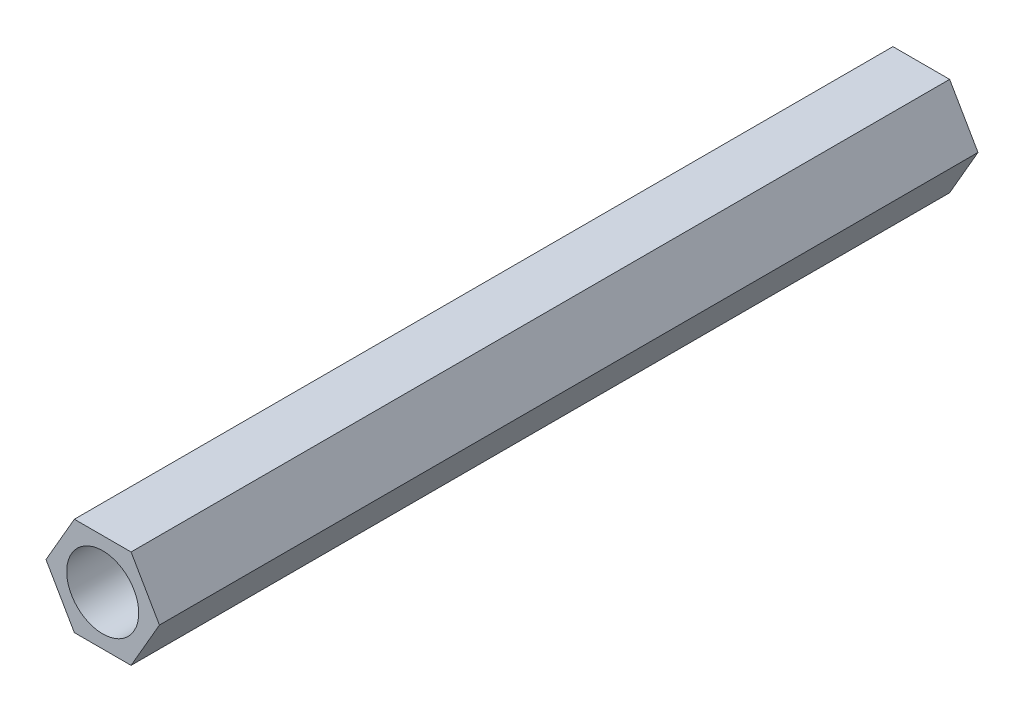
ISO-10303-21;
HEADER;
FILE_DESCRIPTION(('STEP AP214'),'2;1');
FILE_NAME('part.step','',(''),(''),'','','');
FILE_SCHEMA(('AUTOMOTIVE_DESIGN { 1 0 10303 214 1 1 1 1 }'));
ENDSEC;
DATA;
#1=APPLICATION_CONTEXT('core data for automotive mechanical design processes');
#2=APPLICATION_PROTOCOL_DEFINITION('international standard','automotive_design',2000,#1);
#3=PRODUCT_CONTEXT('',#1,'mechanical');
#4=PRODUCT('Part','Part','',(#3));
#5=PRODUCT_RELATED_PRODUCT_CATEGORY('part','',(#4));
#6=PRODUCT_DEFINITION_FORMATION('','',#4);
#7=PRODUCT_DEFINITION_CONTEXT('part definition',#1,'design');
#8=PRODUCT_DEFINITION('design','',#6,#7);
#9=PRODUCT_DEFINITION_SHAPE('','',#8);
#10=(LENGTH_UNIT() NAMED_UNIT(*) SI_UNIT(.MILLI.,.METRE.));
#11=(NAMED_UNIT(*) PLANE_ANGLE_UNIT() SI_UNIT($,.RADIAN.));
#12=(NAMED_UNIT(*) SI_UNIT($,.STERADIAN.) SOLID_ANGLE_UNIT());
#13=UNCERTAINTY_MEASURE_WITH_UNIT(LENGTH_MEASURE(1.E-05),#10,'distance_accuracy_value','');
#14=(GEOMETRIC_REPRESENTATION_CONTEXT(3) GLOBAL_UNCERTAINTY_ASSIGNED_CONTEXT((#13)) GLOBAL_UNIT_ASSIGNED_CONTEXT((#10,
#11,#12)) REPRESENTATION_CONTEXT('',''));
#15=CARTESIAN_POINT('',(0.,0.,0.));
#16=DIRECTION('',(0.,0.,1.));
#17=DIRECTION('',(1.,0.,0.));
#18=AXIS2_PLACEMENT_3D('',#15,#16,#17);
#19=CARTESIAN_POINT('',(0.866025403784453,-1.49999999999998,25.));
#20=DIRECTION('',(-0.866025403784442,0.499999999999995,0.));
#21=DIRECTION('',(-0.499999999999995,-0.866025403784442,0.));
#22=AXIS2_PLACEMENT_3D('',#19,#20,#21);
#23=PLANE('',#22);
#24=DIRECTION('',(0.499999999999995,0.866025403784441,0.));
#25=VECTOR('',#24,1.);
#26=CARTESIAN_POINT('',(0.866025403784453,-1.49999999999998,0.));
#27=LINE('',#26,#25);
#28=CARTESIAN_POINT('',(0.866025403784453,-1.49999999999998,0.));
#29=VERTEX_POINT('',#28);
#30=CARTESIAN_POINT('',(1.73205080756887,0.,0.));
#31=VERTEX_POINT('',#30);
#32=EDGE_CURVE('E119',#29,#31,#27,.T.);
#33=ORIENTED_EDGE('',*,*,#32,.T.);
#34=DIRECTION('',(0.,0.,-1.));
#35=VECTOR('',#34,1.);
#36=CARTESIAN_POINT('',(1.73205080756887,0.,25.));
#37=LINE('',#36,#35);
#38=CARTESIAN_POINT('',(1.73205080756887,0.,25.));
#39=VERTEX_POINT('',#38);
#40=EDGE_CURVE('E11',#39,#31,#37,.T.);
#41=ORIENTED_EDGE('',*,*,#40,.F.);
#42=DIRECTION('',(0.499999999999995,0.866025403784441,0.));
#43=VECTOR('',#42,1.);
#44=CARTESIAN_POINT('',(0.866025403784453,-1.49999999999998,25.));
#45=LINE('',#44,#43);
#46=CARTESIAN_POINT('',(0.866025403784453,-1.49999999999998,25.));
#47=VERTEX_POINT('',#46);
#48=EDGE_CURVE('E130',#47,#39,#45,.T.);
#49=ORIENTED_EDGE('',*,*,#48,.F.);
#50=DIRECTION('',(0.,0.,-1.));
#51=VECTOR('',#50,1.);
#52=CARTESIAN_POINT('',(0.866025403784453,-1.49999999999998,25.));
#53=LINE('',#52,#51);
#54=EDGE_CURVE('E115',#47,#29,#53,.T.);
#55=ORIENTED_EDGE('',*,*,#54,.T.);
#56=EDGE_LOOP('',(#33,#41,#49,#55));
#57=FACE_BOUND('',#56,.T.);
#58=ADVANCED_FACE('F35',(#57),#23,.F.);
#59=CARTESIAN_POINT('',(1.73205080756887,0.,25.));
#60=DIRECTION('',(-0.866025403784438,-0.500000000000001,0.));
#61=DIRECTION('',(0.500000000000001,-0.866025403784438,0.));
#62=AXIS2_PLACEMENT_3D('',#59,#60,#61);
#63=PLANE('',#62);
#64=DIRECTION('',(-0.500000000000001,0.866025403784438,0.));
#65=VECTOR('',#64,1.);
#66=CARTESIAN_POINT('',(1.73205080756887,0.,0.));
#67=LINE('',#66,#65);
#68=CARTESIAN_POINT('',(0.866025403784432,1.5,0.));
#69=VERTEX_POINT('',#68);
#70=EDGE_CURVE('E122',#31,#69,#67,.T.);
#71=ORIENTED_EDGE('',*,*,#70,.T.);
#72=DIRECTION('',(0.,0.,-1.));
#73=VECTOR('',#72,1.);
#74=CARTESIAN_POINT('',(0.866025403784432,1.5,25.));
#75=LINE('',#74,#73);
#76=CARTESIAN_POINT('',(0.866025403784432,1.5,25.));
#77=VERTEX_POINT('',#76);
#78=EDGE_CURVE('E43',#77,#69,#75,.T.);
#79=ORIENTED_EDGE('',*,*,#78,.F.);
#80=DIRECTION('',(-0.500000000000001,0.866025403784438,0.));
#81=VECTOR('',#80,1.);
#82=CARTESIAN_POINT('',(1.73205080756887,0.,25.));
#83=LINE('',#82,#81);
#84=EDGE_CURVE('E88',#39,#77,#83,.T.);
#85=ORIENTED_EDGE('',*,*,#84,.F.);
#86=ORIENTED_EDGE('',*,*,#40,.T.);
#87=EDGE_LOOP('',(#71,#79,#85,#86));
#88=FACE_BOUND('',#87,.T.);
#89=ADVANCED_FACE('F155',(#88),#63,.F.);
#90=CARTESIAN_POINT('',(0.866025403784432,1.5,25.));
#91=DIRECTION('',(0.,-1.,0.));
#92=DIRECTION('',(1.,0.,0.));
#93=AXIS2_PLACEMENT_3D('',#90,#91,#92);
#94=PLANE('',#93);
#95=DIRECTION('',(-1.,0.,0.));
#96=VECTOR('',#95,1.);
#97=CARTESIAN_POINT('',(0.866025403784432,1.5,0.));
#98=LINE('',#97,#96);
#99=CARTESIAN_POINT('',(-0.866025403784443,1.49999999999999,0.));
#100=VERTEX_POINT('',#99);
#101=EDGE_CURVE('E125',#69,#100,#98,.T.);
#102=ORIENTED_EDGE('',*,*,#101,.T.);
#103=DIRECTION('',(0.,0.,-1.));
#104=VECTOR('',#103,1.);
#105=CARTESIAN_POINT('',(-0.866025403784443,1.49999999999999,25.));
#106=LINE('',#105,#104);
#107=CARTESIAN_POINT('',(-0.866025403784443,1.49999999999999,25.));
#108=VERTEX_POINT('',#107);
#109=EDGE_CURVE('E110',#108,#100,#106,.T.);
#110=ORIENTED_EDGE('',*,*,#109,.F.);
#111=DIRECTION('',(-1.,0.,0.));
#112=VECTOR('',#111,1.);
#113=CARTESIAN_POINT('',(0.866025403784432,1.5,25.));
#114=LINE('',#113,#112);
#115=EDGE_CURVE('E101',#77,#108,#114,.T.);
#116=ORIENTED_EDGE('',*,*,#115,.F.);
#117=ORIENTED_EDGE('',*,*,#78,.T.);
#118=EDGE_LOOP('',(#102,#110,#116,#117));
#119=FACE_BOUND('',#118,.T.);
#120=ADVANCED_FACE('F136',(#119),#94,.F.);
#121=CARTESIAN_POINT('',(-0.866025403784443,1.49999999999999,25.));
#122=DIRECTION('',(0.866025403784442,-0.499999999999995,0.));
#123=DIRECTION('',(0.499999999999995,0.866025403784442,0.));
#124=AXIS2_PLACEMENT_3D('',#121,#122,#123);
#125=PLANE('',#124);
#126=DIRECTION('',(-0.499999999999995,-0.866025403784441,0.));
#127=VECTOR('',#126,1.);
#128=CARTESIAN_POINT('',(-0.866025403784443,1.49999999999999,0.));
#129=LINE('',#128,#127);
#130=CARTESIAN_POINT('',(-1.73205080756887,0.,0.));
#131=VERTEX_POINT('',#130);
#132=EDGE_CURVE('E109',#100,#131,#129,.T.);
#133=ORIENTED_EDGE('',*,*,#132,.T.);
#134=DIRECTION('',(0.,0.,-1.));
#135=VECTOR('',#134,1.);
#136=CARTESIAN_POINT('',(-1.73205080756887,0.,25.));
#137=LINE('',#136,#135);
#138=CARTESIAN_POINT('',(-1.73205080756887,0.,25.));
#139=VERTEX_POINT('',#138);
#140=EDGE_CURVE('E106',#139,#131,#137,.T.);
#141=ORIENTED_EDGE('',*,*,#140,.F.);
#142=DIRECTION('',(-0.499999999999995,-0.866025403784441,0.));
#143=VECTOR('',#142,1.);
#144=CARTESIAN_POINT('',(-0.866025403784443,1.49999999999999,25.));
#145=LINE('',#144,#143);
#146=EDGE_CURVE('E95',#108,#139,#145,.T.);
#147=ORIENTED_EDGE('',*,*,#146,.F.);
#148=ORIENTED_EDGE('',*,*,#109,.T.);
#149=EDGE_LOOP('',(#133,#141,#147,#148));
#150=FACE_BOUND('',#149,.T.);
#151=ADVANCED_FACE('F107',(#150),#125,.F.);
#152=CARTESIAN_POINT('',(-1.73205080756887,0.,25.));
#153=DIRECTION('',(0.866025403784435,0.500000000000007,0.));
#154=DIRECTION('',(-0.500000000000007,0.866025403784435,0.));
#155=AXIS2_PLACEMENT_3D('',#152,#153,#154);
#156=PLANE('',#155);
#157=DIRECTION('',(0.500000000000007,-0.866025403784435,0.));
#158=VECTOR('',#157,1.);
#159=CARTESIAN_POINT('',(-1.73205080756887,0.,0.));
#160=LINE('',#159,#158);
#161=CARTESIAN_POINT('',(-0.866025403784422,-1.5,0.));
#162=VERTEX_POINT('',#161);
#163=EDGE_CURVE('E74',#131,#162,#160,.T.);
#164=ORIENTED_EDGE('',*,*,#163,.T.);
#165=DIRECTION('',(0.,0.,-1.));
#166=VECTOR('',#165,1.);
#167=CARTESIAN_POINT('',(-0.866025403784422,-1.5,25.));
#168=LINE('',#167,#166);
#169=CARTESIAN_POINT('',(-0.866025403784422,-1.5,25.));
#170=VERTEX_POINT('',#169);
#171=EDGE_CURVE('E111',#170,#162,#168,.T.);
#172=ORIENTED_EDGE('',*,*,#171,.F.);
#173=DIRECTION('',(0.500000000000007,-0.866025403784435,0.));
#174=VECTOR('',#173,1.);
#175=CARTESIAN_POINT('',(-1.73205080756887,0.,25.));
#176=LINE('',#175,#174);
#177=EDGE_CURVE('E99',#139,#170,#176,.T.);
#178=ORIENTED_EDGE('',*,*,#177,.F.);
#179=ORIENTED_EDGE('',*,*,#140,.T.);
#180=EDGE_LOOP('',(#164,#172,#178,#179));
#181=FACE_BOUND('',#180,.T.);
#182=ADVANCED_FACE('F113',(#181),#156,.F.);
#183=CARTESIAN_POINT('',(-0.866025403784422,-1.5,25.));
#184=DIRECTION('',(0.,1.,0.));
#185=DIRECTION('',(-1.,0.,0.));
#186=AXIS2_PLACEMENT_3D('',#183,#184,#185);
#187=PLANE('',#186);
#188=DIRECTION('',(1.,0.,0.));
#189=VECTOR('',#188,1.);
#190=CARTESIAN_POINT('',(-0.866025403784422,-1.5,0.));
#191=LINE('',#190,#189);
#192=EDGE_CURVE('E80',#162,#29,#191,.T.);
#193=ORIENTED_EDGE('',*,*,#192,.T.);
#194=ORIENTED_EDGE('',*,*,#54,.F.);
#195=DIRECTION('',(1.,0.,0.));
#196=VECTOR('',#195,1.);
#197=CARTESIAN_POINT('',(-0.866025403784422,-1.5,25.));
#198=LINE('',#197,#196);
#199=EDGE_CURVE('E51',#170,#47,#198,.T.);
#200=ORIENTED_EDGE('',*,*,#199,.F.);
#201=ORIENTED_EDGE('',*,*,#171,.T.);
#202=EDGE_LOOP('',(#193,#194,#200,#201));
#203=FACE_BOUND('',#202,.T.);
#204=ADVANCED_FACE('F143',(#203),#187,.F.);
#205=CARTESIAN_POINT('',(0.,0.,25.));
#206=DIRECTION('',(0.,0.,1.));
#207=DIRECTION('',(1.,0.,0.));
#208=AXIS2_PLACEMENT_3D('',#205,#206,#207);
#209=PLANE('',#208);
#210=CARTESIAN_POINT('',(0.,0.,25.));
#211=DIRECTION('',(0.,0.,1.));
#212=DIRECTION('',(1.,0.,0.));
#213=AXIS2_PLACEMENT_3D('',#210,#211,#212);
#214=CIRCLE('',#213,1.1);
#215=CARTESIAN_POINT('',(1.1,0.,25.));
#216=VERTEX_POINT('',#215);
#217=EDGE_CURVE('E238',#216,#216,#214,.T.);
#218=ORIENTED_EDGE('',*,*,#217,.F.);
#219=EDGE_LOOP('',(#218));
#220=FACE_BOUND('',#219,.T.);
#221=ORIENTED_EDGE('',*,*,#48,.T.);
#222=ORIENTED_EDGE('',*,*,#84,.T.);
#223=ORIENTED_EDGE('',*,*,#115,.T.);
#224=ORIENTED_EDGE('',*,*,#146,.T.);
#225=ORIENTED_EDGE('',*,*,#177,.T.);
#226=ORIENTED_EDGE('',*,*,#199,.T.);
#227=EDGE_LOOP('',(#221,#222,#223,#224,#225,#226));
#228=FACE_BOUND('',#227,.T.);
#229=ADVANCED_FACE('F97',(#220,#228),#209,.T.);
#230=CARTESIAN_POINT('',(0.,0.,0.));
#231=DIRECTION('',(0.,0.,1.));
#232=DIRECTION('',(1.,0.,0.));
#233=AXIS2_PLACEMENT_3D('',#230,#231,#232);
#234=PLANE('',#233);
#235=CARTESIAN_POINT('',(0.,0.,0.));
#236=DIRECTION('',(0.,0.,-1.));
#237=DIRECTION('',(-1.,0.,0.));
#238=AXIS2_PLACEMENT_3D('',#235,#236,#237);
#239=CIRCLE('',#238,1.1);
#240=CARTESIAN_POINT('',(-1.1,0.,0.));
#241=VERTEX_POINT('',#240);
#242=EDGE_CURVE('E239',#241,#241,#239,.T.);
#243=ORIENTED_EDGE('',*,*,#242,.F.);
#244=EDGE_LOOP('',(#243));
#245=FACE_BOUND('',#244,.T.);
#246=ORIENTED_EDGE('',*,*,#32,.F.);
#247=ORIENTED_EDGE('',*,*,#192,.F.);
#248=ORIENTED_EDGE('',*,*,#163,.F.);
#249=ORIENTED_EDGE('',*,*,#132,.F.);
#250=ORIENTED_EDGE('',*,*,#101,.F.);
#251=ORIENTED_EDGE('',*,*,#70,.F.);
#252=EDGE_LOOP('',(#246,#247,#248,#249,#250,#251));
#253=FACE_BOUND('',#252,.T.);
#254=ADVANCED_FACE('F139',(#245,#253),#234,.F.);
#255=CARTESIAN_POINT('',(0.,0.,22.));
#256=DIRECTION('',(0.,0.,1.));
#257=DIRECTION('',(1.,0.,0.));
#258=AXIS2_PLACEMENT_3D('',#255,#256,#257);
#259=CYLINDRICAL_SURFACE('',#258,1.1);
#260=CARTESIAN_POINT('',(0.,0.,22.));
#261=DIRECTION('',(0.,0.,1.));
#262=DIRECTION('',(1.,0.,0.));
#263=AXIS2_PLACEMENT_3D('',#260,#261,#262);
#264=CIRCLE('',#263,1.1);
#265=CARTESIAN_POINT('',(1.1,0.,22.));
#266=VERTEX_POINT('',#265);
#267=EDGE_CURVE('E123',#266,#266,#264,.T.);
#268=ORIENTED_EDGE('',*,*,#267,.F.);
#269=EDGE_LOOP('',(#268));
#270=FACE_BOUND('',#269,.T.);
#271=ORIENTED_EDGE('',*,*,#217,.T.);
#272=EDGE_LOOP('',(#271));
#273=FACE_BOUND('',#272,.T.);
#274=ADVANCED_FACE('F190',(#270,#273),#259,.F.);
#275=CARTESIAN_POINT('',(0.,0.,22.));
#276=DIRECTION('',(0.,0.,1.));
#277=DIRECTION('',(1.,0.,0.));
#278=AXIS2_PLACEMENT_3D('',#275,#276,#277);
#279=PLANE('',#278);
#280=ORIENTED_EDGE('',*,*,#267,.T.);
#281=EDGE_LOOP('',(#280));
#282=FACE_BOUND('',#281,.T.);
#283=ADVANCED_FACE('F195',(#282),#279,.T.);
#284=CARTESIAN_POINT('',(0.,0.,3.));
#285=DIRECTION('',(0.,0.,-1.));
#286=DIRECTION('',(-1.,0.,0.));
#287=AXIS2_PLACEMENT_3D('',#284,#285,#286);
#288=CYLINDRICAL_SURFACE('',#287,1.1);
#289=CARTESIAN_POINT('',(0.,0.,3.));
#290=DIRECTION('',(0.,0.,-1.));
#291=DIRECTION('',(-1.,0.,0.));
#292=AXIS2_PLACEMENT_3D('',#289,#290,#291);
#293=CIRCLE('',#292,1.1);
#294=CARTESIAN_POINT('',(-1.1,0.,3.));
#295=VERTEX_POINT('',#294);
#296=EDGE_CURVE('E237',#295,#295,#293,.T.);
#297=ORIENTED_EDGE('',*,*,#296,.F.);
#298=EDGE_LOOP('',(#297));
#299=FACE_BOUND('',#298,.T.);
#300=ORIENTED_EDGE('',*,*,#242,.T.);
#301=EDGE_LOOP('',(#300));
#302=FACE_BOUND('',#301,.T.);
#303=ADVANCED_FACE('F205',(#299,#302),#288,.F.);
#304=CARTESIAN_POINT('',(0.,0.,3.));
#305=DIRECTION('',(0.,0.,-1.));
#306=DIRECTION('',(-1.,0.,0.));
#307=AXIS2_PLACEMENT_3D('',#304,#305,#306);
#308=PLANE('',#307);
#309=ORIENTED_EDGE('',*,*,#296,.T.);
#310=EDGE_LOOP('',(#309));
#311=FACE_BOUND('',#310,.T.);
#312=ADVANCED_FACE('F221',(#311),#308,.T.);
#313=CLOSED_SHELL('',(#58,#89,#120,#151,#182,#204,#229,#254,#274,#283,#303,#312));
#314=MANIFOLD_SOLID_BREP('B2',#313);
#315=ADVANCED_BREP_SHAPE_REPRESENTATION('',(#18,#314),#14);
#316=SHAPE_DEFINITION_REPRESENTATION(#9,#315);
ENDSEC;
END-ISO-10303-21;
